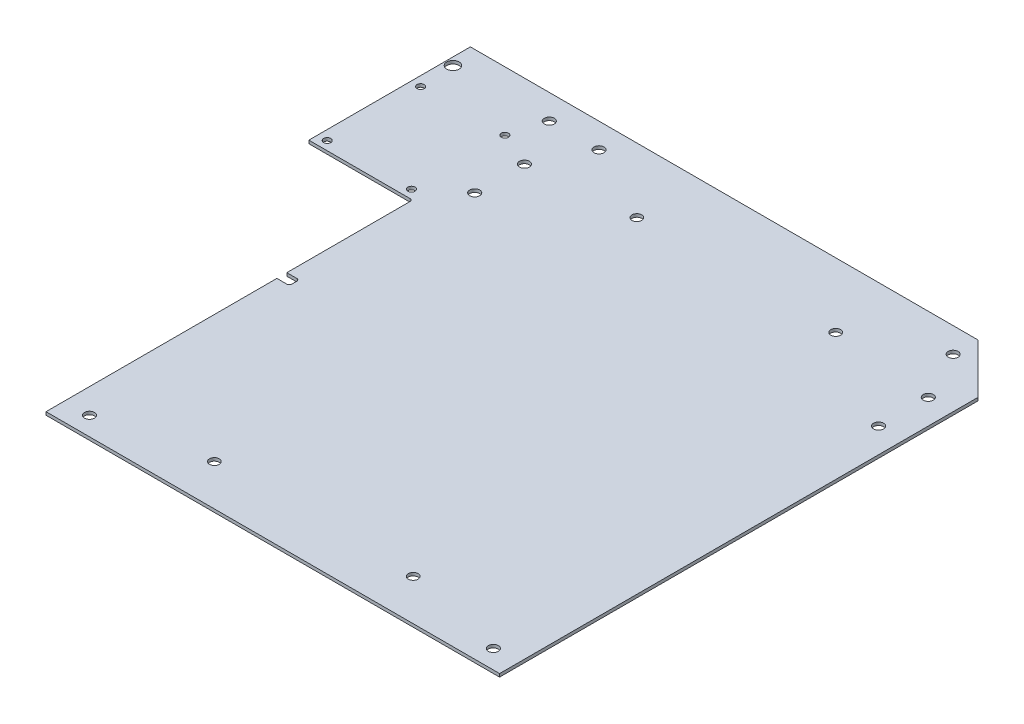
ISO-10303-21;
HEADER;
FILE_DESCRIPTION(('STEP AP214'),'2;1');
FILE_NAME('part.step','',(''),(''),'','','');
FILE_SCHEMA(('AUTOMOTIVE_DESIGN { 1 0 10303 214 1 1 1 1 }'));
ENDSEC;
DATA;
#1=APPLICATION_CONTEXT('core data for automotive mechanical design processes');
#2=APPLICATION_PROTOCOL_DEFINITION('international standard','automotive_design',2000,#1);
#3=PRODUCT_CONTEXT('',#1,'mechanical');
#4=PRODUCT('Part','Part','',(#3));
#5=PRODUCT_RELATED_PRODUCT_CATEGORY('part','',(#4));
#6=PRODUCT_DEFINITION_FORMATION('','',#4);
#7=PRODUCT_DEFINITION_CONTEXT('part definition',#1,'design');
#8=PRODUCT_DEFINITION('design','',#6,#7);
#9=PRODUCT_DEFINITION_SHAPE('','',#8);
#10=(LENGTH_UNIT() NAMED_UNIT(*) SI_UNIT(.MILLI.,.METRE.));
#11=(NAMED_UNIT(*) PLANE_ANGLE_UNIT() SI_UNIT($,.RADIAN.));
#12=(NAMED_UNIT(*) SI_UNIT($,.STERADIAN.) SOLID_ANGLE_UNIT());
#13=UNCERTAINTY_MEASURE_WITH_UNIT(LENGTH_MEASURE(1.E-05),#10,'distance_accuracy_value','');
#14=(GEOMETRIC_REPRESENTATION_CONTEXT(3) GLOBAL_UNCERTAINTY_ASSIGNED_CONTEXT((#13)) GLOBAL_UNIT_ASSIGNED_CONTEXT((#10,
#11,#12)) REPRESENTATION_CONTEXT('',''));
#15=CARTESIAN_POINT('',(0.,0.,0.));
#16=DIRECTION('',(0.,0.,1.));
#17=DIRECTION('',(1.,0.,0.));
#18=AXIS2_PLACEMENT_3D('',#15,#16,#17);
#19=CARTESIAN_POINT('',(-97.4265046484034,0.,-182.433465163806));
#20=DIRECTION('',(0.,-1.,0.));
#21=DIRECTION('',(0.,0.,-1.));
#22=AXIS2_PLACEMENT_3D('',#19,#20,#21);
#23=PLANE('',#22);
#24=CARTESIAN_POINT('',(-31.0690043991156,0.,-233.22189625033));
#25=DIRECTION('',(0.,1.,0.));
#26=DIRECTION('',(0.,0.,1.));
#27=AXIS2_PLACEMENT_3D('',#24,#25,#26);
#28=CIRCLE('',#27,2.48919999999999);
#29=CARTESIAN_POINT('',(-31.0690043991156,0.,-230.73269625033));
#30=VERTEX_POINT('',#29);
#31=EDGE_CURVE('E433',#30,#30,#28,.T.);
#32=ORIENTED_EDGE('',*,*,#31,.T.);
#33=EDGE_LOOP('',(#32));
#34=FACE_BOUND('',#33,.T.);
#35=CARTESIAN_POINT('',(-31.0690043991156,0.,-17.3218962503304));
#36=DIRECTION('',(0.,1.,0.));
#37=DIRECTION('',(0.,0.,1.));
#38=AXIS2_PLACEMENT_3D('',#35,#36,#37);
#39=CIRCLE('',#38,2.48919999999999);
#40=CARTESIAN_POINT('',(-31.0690043991156,0.,-14.8326962503304));
#41=VERTEX_POINT('',#40);
#42=EDGE_CURVE('E394',#41,#41,#39,.T.);
#43=ORIENTED_EDGE('',*,*,#42,.T.);
#44=EDGE_LOOP('',(#43));
#45=FACE_BOUND('',#44,.T.);
#46=DIRECTION('',(-1.,0.,0.));
#47=VECTOR('',#46,1.);
#48=CARTESIAN_POINT('',(-91.0765046484034,0.,-119.441465166843));
#49=LINE('',#48,#47);
#50=CARTESIAN_POINT('',(-91.0765046484034,0.,-119.441465166843));
#51=VERTEX_POINT('',#50);
#52=CARTESIAN_POINT('',(-96.1565046484034,0.,-119.441465166843));
#53=VERTEX_POINT('',#52);
#54=EDGE_CURVE('E355',#51,#53,#49,.T.);
#55=ORIENTED_EDGE('',*,*,#54,.T.);
#56=DIRECTION('',(0.,0.,1.));
#57=VECTOR('',#56,1.);
#58=CARTESIAN_POINT('',(-96.1565046484034,0.,3.62153483315741));
#59=LINE('',#58,#57);
#60=CARTESIAN_POINT('',(-96.1565046484034,0.,-182.433465163806));
#61=VERTEX_POINT('',#60);
#62=EDGE_CURVE('E188',#61,#53,#59,.T.);
#63=ORIENTED_EDGE('',*,*,#62,.F.);
#64=CARTESIAN_POINT('',(-97.4265046484034,0.,-182.433465163806));
#65=DIRECTION('',(0.,-1.,0.));
#66=DIRECTION('',(0.,0.,-1.));
#67=AXIS2_PLACEMENT_3D('',#64,#65,#66);
#68=CIRCLE('',#67,1.26999999999999);
#69=CARTESIAN_POINT('',(-97.4265046484034,0.,-183.703465163806));
#70=VERTEX_POINT('',#69);
#71=EDGE_CURVE('E185',#70,#61,#68,.T.);
#72=ORIENTED_EDGE('',*,*,#71,.F.);
#73=DIRECTION('',(1.,0.,0.));
#74=VECTOR('',#73,1.);
#75=CARTESIAN_POINT('',(-149.179004652955,0.,-183.703465163806));
#76=LINE('',#75,#74);
#77=CARTESIAN_POINT('',(-149.179004652955,0.,-183.703465163806));
#78=VERTEX_POINT('',#77);
#79=EDGE_CURVE('E145',#78,#70,#76,.T.);
#80=ORIENTED_EDGE('',*,*,#79,.F.);
#81=DIRECTION('',(0.,0.,1.));
#82=VECTOR('',#81,1.);
#83=CARTESIAN_POINT('',(-149.179004652955,0.,-266.253465163806));
#84=LINE('',#83,#82);
#85=CARTESIAN_POINT('',(-149.179004652955,0.,-266.253465163806));
#86=VERTEX_POINT('',#85);
#87=EDGE_CURVE('E180',#86,#78,#84,.T.);
#88=ORIENTED_EDGE('',*,*,#87,.F.);
#89=DIRECTION('',(-1.,0.,0.));
#90=VECTOR('',#89,1.);
#91=CARTESIAN_POINT('',(-70.7565046954415,0.,-266.253465163806));
#92=LINE('',#91,#90);
#93=CARTESIAN_POINT('',(110.218495880853,0.,-266.253465163807));
#94=VERTEX_POINT('',#93);
#95=EDGE_CURVE('E177',#94,#86,#92,.T.);
#96=ORIENTED_EDGE('',*,*,#95,.F.);
#97=DIRECTION('',(-0.707106780825484,0.,-0.707106781547611));
#98=VECTOR('',#97,1.);
#99=CARTESIAN_POINT('',(135.618495854913,0.,-240.853465163806));
#100=LINE('',#99,#98);
#101=CARTESIAN_POINT('',(135.618495854913,0.,-240.853465163806));
#102=VERTEX_POINT('',#101);
#103=EDGE_CURVE('E173',#102,#94,#100,.T.);
#104=ORIENTED_EDGE('',*,*,#103,.F.);
#105=DIRECTION('',(0.,0.,-1.));
#106=VECTOR('',#105,1.);
#107=CARTESIAN_POINT('',(135.618495854913,0.,3.62153483315741));
#108=LINE('',#107,#106);
#109=CARTESIAN_POINT('',(135.618495854913,0.,3.62153483315741));
#110=VERTEX_POINT('',#109);
#111=EDGE_CURVE('E169',#110,#102,#108,.T.);
#112=ORIENTED_EDGE('',*,*,#111,.F.);
#113=DIRECTION('',(1.,0.,0.));
#114=VECTOR('',#113,1.);
#115=CARTESIAN_POINT('',(-96.1565046484034,0.,3.62153483315741));
#116=LINE('',#115,#114);
#117=CARTESIAN_POINT('',(-96.1565046484034,0.,3.62153483315741));
#118=VERTEX_POINT('',#117);
#119=EDGE_CURVE('E165',#118,#110,#116,.T.);
#120=ORIENTED_EDGE('',*,*,#119,.F.);
#121=CARTESIAN_POINT('',(-96.1565046484034,0.,-114.361465166843));
#122=VERTEX_POINT('',#121);
#123=EDGE_CURVE('E103',#122,#118,#59,.T.);
#124=ORIENTED_EDGE('',*,*,#123,.F.);
#125=DIRECTION('',(1.,0.,0.));
#126=VECTOR('',#125,1.);
#127=CARTESIAN_POINT('',(-96.1565046484034,0.,-114.361465166843));
#128=LINE('',#127,#126);
#129=CARTESIAN_POINT('',(-91.0765046484034,0.,-114.361465166843));
#130=VERTEX_POINT('',#129);
#131=EDGE_CURVE('E377',#122,#130,#128,.T.);
#132=ORIENTED_EDGE('',*,*,#131,.T.);
#133=CARTESIAN_POINT('',(-91.0765046484034,0.,-115.631465166843));
#134=DIRECTION('',(0.,1.,0.));
#135=DIRECTION('',(0.,0.,1.));
#136=AXIS2_PLACEMENT_3D('',#133,#134,#135);
#137=CIRCLE('',#136,1.26999999999999);
#138=CARTESIAN_POINT('',(-89.8065046484034,0.,-115.631465166843));
#139=VERTEX_POINT('',#138);
#140=EDGE_CURVE('E60',#130,#139,#137,.T.);
#141=ORIENTED_EDGE('',*,*,#140,.T.);
#142=DIRECTION('',(0.,0.,-1.));
#143=VECTOR('',#142,1.);
#144=CARTESIAN_POINT('',(-89.8065046484034,0.,-115.631465166843));
#145=LINE('',#144,#143);
#146=CARTESIAN_POINT('',(-89.8065046484034,0.,-118.171465166843));
#147=VERTEX_POINT('',#146);
#148=EDGE_CURVE('E401',#139,#147,#145,.T.);
#149=ORIENTED_EDGE('',*,*,#148,.T.);
#150=CARTESIAN_POINT('',(-91.0765046484034,0.,-118.171465166843));
#151=DIRECTION('',(0.,1.,0.));
#152=DIRECTION('',(0.,0.,1.));
#153=AXIS2_PLACEMENT_3D('',#150,#151,#152);
#154=CIRCLE('',#153,1.26999999999999);
#155=EDGE_CURVE('E397',#147,#51,#154,.T.);
#156=ORIENTED_EDGE('',*,*,#155,.T.);
#157=EDGE_LOOP('',(#55,#63,#72,#80,#88,#96,#104,#112,#120,#124,#132,#141,#149,#156));
#158=FACE_BOUND('',#157,.T.);
#159=CARTESIAN_POINT('',(-144.30515752718,0.,-235.976041670875));
#160=DIRECTION('',(0.,1.,0.));
#161=DIRECTION('',(0.,0.,1.));
#162=AXIS2_PLACEMENT_3D('',#159,#160,#161);
#163=CIRCLE('',#162,1.82879999999999);
#164=CARTESIAN_POINT('',(-144.30515752718,0.,-234.147241670875));
#165=VERTEX_POINT('',#164);
#166=EDGE_CURVE('E341',#165,#165,#163,.T.);
#167=ORIENTED_EDGE('',*,*,#166,.T.);
#168=EDGE_LOOP('',(#167));
#169=FACE_BOUND('',#168,.T.);
#170=CARTESIAN_POINT('',(-144.30515752718,0.,-188.226395138011));
#171=DIRECTION('',(0.,1.,0.));
#172=DIRECTION('',(0.,0.,1.));
#173=AXIS2_PLACEMENT_3D('',#170,#171,#172);
#174=CIRCLE('',#173,1.82879999999999);
#175=CARTESIAN_POINT('',(-144.30515752718,0.,-186.397595138011));
#176=VERTEX_POINT('',#175);
#177=EDGE_CURVE('E333',#176,#176,#174,.T.);
#178=ORIENTED_EDGE('',*,*,#177,.T.);
#179=EDGE_LOOP('',(#178));
#180=FACE_BOUND('',#179,.T.);
#181=CARTESIAN_POINT('',(-101.258714707612,0.,-188.226395138011));
#182=DIRECTION('',(0.,1.,0.));
#183=DIRECTION('',(0.,0.,1.));
#184=AXIS2_PLACEMENT_3D('',#181,#182,#183);
#185=CIRCLE('',#184,1.82880000000001);
#186=CARTESIAN_POINT('',(-101.258714707612,0.,-186.397595138011));
#187=VERTEX_POINT('',#186);
#188=EDGE_CURVE('E325',#187,#187,#185,.T.);
#189=ORIENTED_EDGE('',*,*,#188,.T.);
#190=EDGE_LOOP('',(#189));
#191=FACE_BOUND('',#190,.T.);
#192=CARTESIAN_POINT('',(-101.258714707612,0.,-235.978395138011));
#193=DIRECTION('',(0.,1.,0.));
#194=DIRECTION('',(0.,0.,1.));
#195=AXIS2_PLACEMENT_3D('',#192,#193,#194);
#196=CIRCLE('',#195,1.82880000000001);
#197=CARTESIAN_POINT('',(-101.258714707612,0.,-234.149595138011));
#198=VERTEX_POINT('',#197);
#199=EDGE_CURVE('E317',#198,#198,#196,.T.);
#200=ORIENTED_EDGE('',*,*,#199,.T.);
#201=EDGE_LOOP('',(#200));
#202=FACE_BOUND('',#201,.T.);
#203=CARTESIAN_POINT('',(-145.369004652955,0.,-253.553465163806));
#204=DIRECTION('',(0.,-1.,0.));
#205=DIRECTION('',(0.,0.,-1.));
#206=AXIS2_PLACEMENT_3D('',#203,#204,#205);
#207=CIRCLE('',#206,3.17500000000001);
#208=CARTESIAN_POINT('',(-145.369004652955,0.,-256.728465163806));
#209=VERTEX_POINT('',#208);
#210=EDGE_CURVE('E313',#209,#209,#207,.T.);
#211=ORIENTED_EDGE('',*,*,#210,.F.);
#212=EDGE_LOOP('',(#211));
#213=FACE_BOUND('',#212,.T.);
#214=CARTESIAN_POINT('',(-83.4565046529283,0.,-202.753466179806));
#215=DIRECTION('',(0.,1.,0.));
#216=DIRECTION('',(0.,0.,1.));
#217=AXIS2_PLACEMENT_3D('',#214,#215,#216);
#218=CIRCLE('',#217,2.55269999999999);
#219=CARTESIAN_POINT('',(-83.4565046529283,0.,-200.200766179806));
#220=VERTEX_POINT('',#219);
#221=EDGE_CURVE('E301',#220,#220,#218,.T.);
#222=ORIENTED_EDGE('',*,*,#221,.T.);
#223=EDGE_LOOP('',(#222));
#224=FACE_BOUND('',#223,.T.);
#225=CARTESIAN_POINT('',(-83.4565046529283,0.,-228.153466179806));
#226=DIRECTION('',(0.,1.,0.));
#227=DIRECTION('',(0.,0.,1.));
#228=AXIS2_PLACEMENT_3D('',#225,#226,#227);
#229=CIRCLE('',#228,2.55269999999999);
#230=CARTESIAN_POINT('',(-83.4565046529283,0.,-225.600766179806));
#231=VERTEX_POINT('',#230);
#232=EDGE_CURVE('E293',#231,#231,#229,.T.);
#233=ORIENTED_EDGE('',*,*,#232,.T.);
#234=EDGE_LOOP('',(#233));
#235=FACE_BOUND('',#234,.T.);
#236=CARTESIAN_POINT('',(-70.7565046529283,0.,-253.553466179806));
#237=DIRECTION('',(0.,1.,0.));
#238=DIRECTION('',(0.,0.,1.));
#239=AXIS2_PLACEMENT_3D('',#236,#237,#238);
#240=CIRCLE('',#239,2.55269999999999);
#241=CARTESIAN_POINT('',(-70.7565046529283,0.,-251.000766179806));
#242=VERTEX_POINT('',#241);
#243=EDGE_CURVE('E285',#242,#242,#240,.T.);
#244=ORIENTED_EDGE('',*,*,#243,.T.);
#245=EDGE_LOOP('',(#244));
#246=FACE_BOUND('',#245,.T.);
#247=CARTESIAN_POINT('',(122.918495854842,0.,-202.75346516381));
#248=DIRECTION('',(0.,1.,0.));
#249=DIRECTION('',(0.,0.,1.));
#250=AXIS2_PLACEMENT_3D('',#247,#248,#249);
#251=CIRCLE('',#250,2.55269999999999);
#252=CARTESIAN_POINT('',(122.918495854842,0.,-200.20076516381));
#253=VERTEX_POINT('',#252);
#254=EDGE_CURVE('E277',#253,#253,#251,.T.);
#255=ORIENTED_EDGE('',*,*,#254,.T.);
#256=EDGE_LOOP('',(#255));
#257=FACE_BOUND('',#256,.T.);
#258=CARTESIAN_POINT('',(122.918495854842,0.,-228.15346516381));
#259=DIRECTION('',(0.,1.,0.));
#260=DIRECTION('',(0.,0.,1.));
#261=AXIS2_PLACEMENT_3D('',#258,#259,#260);
#262=CIRCLE('',#261,2.55269999999999);
#263=CARTESIAN_POINT('',(122.918495854842,0.,-225.60076516381));
#264=VERTEX_POINT('',#263);
#265=EDGE_CURVE('E269',#264,#264,#262,.T.);
#266=ORIENTED_EDGE('',*,*,#265,.T.);
#267=EDGE_LOOP('',(#266));
#268=FACE_BOUND('',#267,.T.);
#269=CARTESIAN_POINT('',(110.218495854842,0.,-253.553465163811));
#270=DIRECTION('',(0.,1.,0.));
#271=DIRECTION('',(0.,0.,1.));
#272=AXIS2_PLACEMENT_3D('',#269,#270,#271);
#273=CIRCLE('',#272,2.55269999999999);
#274=CARTESIAN_POINT('',(110.218495854842,0.,-251.000765163811));
#275=VERTEX_POINT('',#274);
#276=EDGE_CURVE('E261',#275,#275,#273,.T.);
#277=ORIENTED_EDGE('',*,*,#276,.T.);
#278=EDGE_LOOP('',(#277));
#279=FACE_BOUND('',#278,.T.);
#280=CARTESIAN_POINT('',(-83.4565046529281,0.,-5.9034656718055));
#281=DIRECTION('',(0.,1.,0.));
#282=DIRECTION('',(0.,0.,1.));
#283=AXIS2_PLACEMENT_3D('',#280,#281,#282);
#284=CIRCLE('',#283,2.55269999999999);
#285=CARTESIAN_POINT('',(-83.4565046529281,0.,-3.35076567180551));
#286=VERTEX_POINT('',#285);
#287=EDGE_CURVE('E253',#286,#286,#284,.T.);
#288=ORIENTED_EDGE('',*,*,#287,.T.);
#289=EDGE_LOOP('',(#288));
#290=FACE_BOUND('',#289,.T.);
#291=CARTESIAN_POINT('',(122.918495854914,0.,-5.90346567180618));
#292=DIRECTION('',(0.,1.,0.));
#293=DIRECTION('',(0.,0.,1.));
#294=AXIS2_PLACEMENT_3D('',#291,#292,#293);
#295=CIRCLE('',#294,2.55270000000001);
#296=CARTESIAN_POINT('',(122.918495854914,0.,-3.35076567180617));
#297=VERTEX_POINT('',#296);
#298=EDGE_CURVE('E245',#297,#297,#295,.T.);
#299=ORIENTED_EDGE('',*,*,#298,.T.);
#300=EDGE_LOOP('',(#299));
#301=FACE_BOUND('',#300,.T.);
#302=CARTESIAN_POINT('',(-96.1565047197605,0.,-253.553466178288));
#303=DIRECTION('',(0.,1.,0.));
#304=DIRECTION('',(0.,0.,1.));
#305=AXIS2_PLACEMENT_3D('',#302,#303,#304);
#306=CIRCLE('',#305,2.55269999999999);
#307=CARTESIAN_POINT('',(-96.1565047197605,0.,-251.000766178288));
#308=VERTEX_POINT('',#307);
#309=EDGE_CURVE('E170',#308,#308,#306,.T.);
#310=ORIENTED_EDGE('',*,*,#309,.T.);
#311=EDGE_LOOP('',(#310));
#312=FACE_BOUND('',#311,.T.);
#313=CARTESIAN_POINT('',(70.5309956008844,0.,-17.3218962503304));
#314=DIRECTION('',(0.,1.,0.));
#315=DIRECTION('',(0.,0.,1.));
#316=AXIS2_PLACEMENT_3D('',#313,#314,#315);
#317=CIRCLE('',#316,2.4892);
#318=CARTESIAN_POINT('',(70.5309956008844,0.,-14.8326962503304));
#319=VERTEX_POINT('',#318);
#320=EDGE_CURVE('E417',#319,#319,#317,.T.);
#321=ORIENTED_EDGE('',*,*,#320,.T.);
#322=EDGE_LOOP('',(#321));
#323=FACE_BOUND('',#322,.T.);
#324=CARTESIAN_POINT('',(70.5309956008844,0.,-233.22189625033));
#325=DIRECTION('',(0.,1.,0.));
#326=DIRECTION('',(0.,0.,1.));
#327=AXIS2_PLACEMENT_3D('',#324,#325,#326);
#328=CIRCLE('',#327,2.4892);
#329=CARTESIAN_POINT('',(70.5309956008844,0.,-230.73269625033));
#330=VERTEX_POINT('',#329);
#331=EDGE_CURVE('E425',#330,#330,#328,.T.);
#332=ORIENTED_EDGE('',*,*,#331,.T.);
#333=EDGE_LOOP('',(#332));
#334=FACE_BOUND('',#333,.T.);
#335=ADVANCED_FACE('F44',(#34,#45,#158,#169,#180,#191,#202,#213,#224,#235,#246,#257,#268,#279,
#290,#301,#312,#323,#334),#23,.T.);
#336=CARTESIAN_POINT('',(-96.1565046484034,1.5875,3.62153483315741));
#337=DIRECTION('',(1.,0.,0.));
#338=DIRECTION('',(0.,0.,-1.));
#339=AXIS2_PLACEMENT_3D('',#336,#337,#338);
#340=PLANE('',#339);
#341=ORIENTED_EDGE('',*,*,#62,.T.);
#342=DIRECTION('',(0.,1.,0.));
#343=VECTOR('',#342,1.);
#344=CARTESIAN_POINT('',(-96.1565046484034,0.,-119.441465166843));
#345=LINE('',#344,#343);
#346=CARTESIAN_POINT('',(-96.1565046484034,1.5875,-119.441465166843));
#347=VERTEX_POINT('',#346);
#348=EDGE_CURVE('E349',#53,#347,#345,.T.);
#349=ORIENTED_EDGE('',*,*,#348,.T.);
#350=DIRECTION('',(0.,0.,1.));
#351=VECTOR('',#350,1.);
#352=CARTESIAN_POINT('',(-96.1565046484034,1.5875,3.62153483315741));
#353=LINE('',#352,#351);
#354=CARTESIAN_POINT('',(-96.1565046484034,1.5875,-182.433465163806));
#355=VERTEX_POINT('',#354);
#356=EDGE_CURVE('E159',#355,#347,#353,.T.);
#357=ORIENTED_EDGE('',*,*,#356,.F.);
#358=DIRECTION('',(0.,-1.,0.));
#359=VECTOR('',#358,1.);
#360=CARTESIAN_POINT('',(-96.1565046484034,1.5875,-182.433465163806));
#361=LINE('',#360,#359);
#362=EDGE_CURVE('E150',#355,#61,#361,.T.);
#363=ORIENTED_EDGE('',*,*,#362,.T.);
#364=EDGE_LOOP('',(#341,#349,#357,#363));
#365=FACE_BOUND('',#364,.T.);
#366=ADVANCED_FACE('F496',(#365),#340,.F.);
#367=CARTESIAN_POINT('',(-96.1565046484034,1.5875,3.62153483315741));
#368=DIRECTION('',(0.,0.,-1.));
#369=DIRECTION('',(-1.,0.,0.));
#370=AXIS2_PLACEMENT_3D('',#367,#368,#369);
#371=PLANE('',#370);
#372=ORIENTED_EDGE('',*,*,#119,.T.);
#373=DIRECTION('',(0.,-1.,0.));
#374=VECTOR('',#373,1.);
#375=CARTESIAN_POINT('',(135.618495854913,1.5875,3.62153483315741));
#376=LINE('',#375,#374);
#377=CARTESIAN_POINT('',(135.618495854913,1.5875,3.62153483315741));
#378=VERTEX_POINT('',#377);
#379=EDGE_CURVE('E11',#378,#110,#376,.T.);
#380=ORIENTED_EDGE('',*,*,#379,.F.);
#381=DIRECTION('',(1.,0.,0.));
#382=VECTOR('',#381,1.);
#383=CARTESIAN_POINT('',(-96.1565046484034,1.5875,3.62153483315741));
#384=LINE('',#383,#382);
#385=CARTESIAN_POINT('',(-96.1565046484034,1.5875,3.62153483315741));
#386=VERTEX_POINT('',#385);
#387=EDGE_CURVE('E192',#386,#378,#384,.T.);
#388=ORIENTED_EDGE('',*,*,#387,.F.);
#389=DIRECTION('',(0.,-1.,0.));
#390=VECTOR('',#389,1.);
#391=CARTESIAN_POINT('',(-96.1565046484034,1.5875,3.62153483315741));
#392=LINE('',#391,#390);
#393=EDGE_CURVE('E164',#386,#118,#392,.T.);
#394=ORIENTED_EDGE('',*,*,#393,.T.);
#395=EDGE_LOOP('',(#372,#380,#388,#394));
#396=FACE_BOUND('',#395,.T.);
#397=ADVANCED_FACE('F46',(#396),#371,.F.);
#398=CARTESIAN_POINT('',(135.618495854913,1.5875,3.62153483315741));
#399=DIRECTION('',(-1.,0.,0.));
#400=DIRECTION('',(0.,0.,1.));
#401=AXIS2_PLACEMENT_3D('',#398,#399,#400);
#402=PLANE('',#401);
#403=ORIENTED_EDGE('',*,*,#111,.T.);
#404=DIRECTION('',(0.,-1.,0.));
#405=VECTOR('',#404,1.);
#406=CARTESIAN_POINT('',(135.618495854913,1.5875,-240.853465163806));
#407=LINE('',#406,#405);
#408=CARTESIAN_POINT('',(135.618495854913,1.5875,-240.853465163806));
#409=VERTEX_POINT('',#408);
#410=EDGE_CURVE('E53',#409,#102,#407,.T.);
#411=ORIENTED_EDGE('',*,*,#410,.F.);
#412=DIRECTION('',(0.,0.,-1.));
#413=VECTOR('',#412,1.);
#414=CARTESIAN_POINT('',(135.618495854913,1.5875,3.62153483315741));
#415=LINE('',#414,#413);
#416=EDGE_CURVE('E111',#378,#409,#415,.T.);
#417=ORIENTED_EDGE('',*,*,#416,.F.);
#418=ORIENTED_EDGE('',*,*,#379,.T.);
#419=EDGE_LOOP('',(#403,#411,#417,#418));
#420=FACE_BOUND('',#419,.T.);
#421=ADVANCED_FACE('F517',(#420),#402,.F.);
#422=CARTESIAN_POINT('',(135.618495854913,1.5875,-240.853465163806));
#423=DIRECTION('',(-0.707106781547611,0.,0.707106780825484));
#424=DIRECTION('',(0.707106780825484,0.,0.707106781547611));
#425=AXIS2_PLACEMENT_3D('',#422,#423,#424);
#426=PLANE('',#425);
#427=ORIENTED_EDGE('',*,*,#103,.T.);
#428=DIRECTION('',(0.,-1.,0.));
#429=VECTOR('',#428,1.);
#430=CARTESIAN_POINT('',(110.218495880853,1.5875,-266.253465163807));
#431=LINE('',#430,#429);
#432=CARTESIAN_POINT('',(110.218495880853,1.5875,-266.253465163807));
#433=VERTEX_POINT('',#432);
#434=EDGE_CURVE('E203',#433,#94,#431,.T.);
#435=ORIENTED_EDGE('',*,*,#434,.F.);
#436=DIRECTION('',(-0.707106780825484,0.,-0.707106781547611));
#437=VECTOR('',#436,1.);
#438=CARTESIAN_POINT('',(135.618495854913,1.5875,-240.853465163806));
#439=LINE('',#438,#437);
#440=EDGE_CURVE('E214',#409,#433,#439,.T.);
#441=ORIENTED_EDGE('',*,*,#440,.F.);
#442=ORIENTED_EDGE('',*,*,#410,.T.);
#443=EDGE_LOOP('',(#427,#435,#441,#442));
#444=FACE_BOUND('',#443,.T.);
#445=ADVANCED_FACE('F212',(#444),#426,.F.);
#446=CARTESIAN_POINT('',(-70.7565046954415,1.5875,-266.253465163806));
#447=DIRECTION('',(0.,0.,1.));
#448=DIRECTION('',(1.,0.,0.));
#449=AXIS2_PLACEMENT_3D('',#446,#447,#448);
#450=PLANE('',#449);
#451=ORIENTED_EDGE('',*,*,#95,.T.);
#452=DIRECTION('',(0.,-1.,0.));
#453=VECTOR('',#452,1.);
#454=CARTESIAN_POINT('',(-149.179004652955,1.5875,-266.253465163806));
#455=LINE('',#454,#453);
#456=CARTESIAN_POINT('',(-149.179004652955,1.5875,-266.253465163806));
#457=VERTEX_POINT('',#456);
#458=EDGE_CURVE('E199',#457,#86,#455,.T.);
#459=ORIENTED_EDGE('',*,*,#458,.F.);
#460=DIRECTION('',(-1.,0.,0.));
#461=VECTOR('',#460,1.);
#462=CARTESIAN_POINT('',(110.218495880853,1.5875,-266.253465163807));
#463=LINE('',#462,#461);
#464=EDGE_CURVE('E227',#433,#457,#463,.T.);
#465=ORIENTED_EDGE('',*,*,#464,.F.);
#466=ORIENTED_EDGE('',*,*,#434,.T.);
#467=EDGE_LOOP('',(#451,#459,#465,#466));
#468=FACE_BOUND('',#467,.T.);
#469=ADVANCED_FACE('F222',(#468),#450,.F.);
#470=CARTESIAN_POINT('',(-149.179004652955,1.5875,-266.253465163806));
#471=DIRECTION('',(1.,0.,0.));
#472=DIRECTION('',(0.,0.,-1.));
#473=AXIS2_PLACEMENT_3D('',#470,#471,#472);
#474=PLANE('',#473);
#475=ORIENTED_EDGE('',*,*,#87,.T.);
#476=DIRECTION('',(0.,-1.,0.));
#477=VECTOR('',#476,1.);
#478=CARTESIAN_POINT('',(-149.179004652955,1.5875,-183.703465163806));
#479=LINE('',#478,#477);
#480=CARTESIAN_POINT('',(-149.179004652955,1.5875,-183.703465163806));
#481=VERTEX_POINT('',#480);
#482=EDGE_CURVE('E149',#481,#78,#479,.T.);
#483=ORIENTED_EDGE('',*,*,#482,.F.);
#484=DIRECTION('',(0.,0.,1.));
#485=VECTOR('',#484,1.);
#486=CARTESIAN_POINT('',(-149.179004652955,1.5875,-266.253465163806));
#487=LINE('',#486,#485);
#488=EDGE_CURVE('E135',#457,#481,#487,.T.);
#489=ORIENTED_EDGE('',*,*,#488,.F.);
#490=ORIENTED_EDGE('',*,*,#458,.T.);
#491=EDGE_LOOP('',(#475,#483,#489,#490));
#492=FACE_BOUND('',#491,.T.);
#493=ADVANCED_FACE('F225',(#492),#474,.F.);
#494=CARTESIAN_POINT('',(-149.179004652955,1.5875,-183.703465163806));
#495=DIRECTION('',(0.,0.,-1.));
#496=DIRECTION('',(-1.,0.,0.));
#497=AXIS2_PLACEMENT_3D('',#494,#495,#496);
#498=PLANE('',#497);
#499=ORIENTED_EDGE('',*,*,#79,.T.);
#500=DIRECTION('',(0.,-1.,0.));
#501=VECTOR('',#500,1.);
#502=CARTESIAN_POINT('',(-97.4265046484034,1.5875,-183.703465163806));
#503=LINE('',#502,#501);
#504=CARTESIAN_POINT('',(-97.4265046484034,1.5875,-183.703465163806));
#505=VERTEX_POINT('',#504);
#506=EDGE_CURVE('E142',#505,#70,#503,.T.);
#507=ORIENTED_EDGE('',*,*,#506,.F.);
#508=DIRECTION('',(1.,0.,0.));
#509=VECTOR('',#508,1.);
#510=CARTESIAN_POINT('',(-149.179004652955,1.5875,-183.703465163806));
#511=LINE('',#510,#509);
#512=EDGE_CURVE('E127',#481,#505,#511,.T.);
#513=ORIENTED_EDGE('',*,*,#512,.F.);
#514=ORIENTED_EDGE('',*,*,#482,.T.);
#515=EDGE_LOOP('',(#499,#507,#513,#514));
#516=FACE_BOUND('',#515,.T.);
#517=ADVANCED_FACE('F143',(#516),#498,.F.);
#518=CARTESIAN_POINT('',(-97.4265046484034,1.5875,-182.433465163806));
#519=DIRECTION('',(0.,-1.,0.));
#520=DIRECTION('',(0.,0.,-1.));
#521=AXIS2_PLACEMENT_3D('',#518,#519,#520);
#522=CYLINDRICAL_SURFACE('',#521,1.26999999999999);
#523=ORIENTED_EDGE('',*,*,#71,.T.);
#524=ORIENTED_EDGE('',*,*,#362,.F.);
#525=CARTESIAN_POINT('',(-97.4265046484034,1.5875,-182.433465163806));
#526=DIRECTION('',(0.,-1.,0.));
#527=DIRECTION('',(0.,0.,-1.));
#528=AXIS2_PLACEMENT_3D('',#525,#526,#527);
#529=CIRCLE('',#528,1.26999999999999);
#530=EDGE_CURVE('E132',#505,#355,#529,.T.);
#531=ORIENTED_EDGE('',*,*,#530,.F.);
#532=ORIENTED_EDGE('',*,*,#506,.T.);
#533=EDGE_LOOP('',(#523,#524,#531,#532));
#534=FACE_BOUND('',#533,.T.);
#535=ADVANCED_FACE('F152',(#534),#522,.F.);
#536=CARTESIAN_POINT('',(-96.1565046484034,1.5875,-114.361465166843));
#537=VERTEX_POINT('',#536);
#538=EDGE_CURVE('E69',#537,#386,#353,.T.);
#539=ORIENTED_EDGE('',*,*,#538,.F.);
#540=DIRECTION('',(0.,1.,0.));
#541=VECTOR('',#540,1.);
#542=CARTESIAN_POINT('',(-96.1565046484034,0.,-114.361465166843));
#543=LINE('',#542,#541);
#544=EDGE_CURVE('E350',#122,#537,#543,.T.);
#545=ORIENTED_EDGE('',*,*,#544,.F.);
#546=ORIENTED_EDGE('',*,*,#123,.T.);
#547=ORIENTED_EDGE('',*,*,#393,.F.);
#548=EDGE_LOOP('',(#539,#545,#546,#547));
#549=FACE_BOUND('',#548,.T.);
#550=ADVANCED_FACE('F447',(#549),#340,.F.);
#551=CARTESIAN_POINT('',(-97.4265046484034,1.5875,-182.433465163806));
#552=DIRECTION('',(0.,-1.,0.));
#553=DIRECTION('',(0.,0.,-1.));
#554=AXIS2_PLACEMENT_3D('',#551,#552,#553);
#555=PLANE('',#554);
#556=CARTESIAN_POINT('',(-31.0690043991156,1.5875,-233.22189625033));
#557=DIRECTION('',(0.,1.,0.));
#558=DIRECTION('',(0.,0.,1.));
#559=AXIS2_PLACEMENT_3D('',#556,#557,#558);
#560=CIRCLE('',#559,2.48919999999999);
#561=CARTESIAN_POINT('',(-31.0690043991156,1.5875,-230.73269625033));
#562=VERTEX_POINT('',#561);
#563=EDGE_CURVE('E437',#562,#562,#560,.T.);
#564=ORIENTED_EDGE('',*,*,#563,.F.);
#565=EDGE_LOOP('',(#564));
#566=FACE_BOUND('',#565,.T.);
#567=CARTESIAN_POINT('',(70.5309956008844,1.5875,-233.22189625033));
#568=DIRECTION('',(0.,1.,0.));
#569=DIRECTION('',(0.,0.,1.));
#570=AXIS2_PLACEMENT_3D('',#567,#568,#569);
#571=CIRCLE('',#570,2.48919999999998);
#572=CARTESIAN_POINT('',(70.5309956008844,1.5875,-230.73269625033));
#573=VERTEX_POINT('',#572);
#574=EDGE_CURVE('E429',#573,#573,#571,.T.);
#575=ORIENTED_EDGE('',*,*,#574,.F.);
#576=EDGE_LOOP('',(#575));
#577=FACE_BOUND('',#576,.T.);
#578=CARTESIAN_POINT('',(70.5309956008844,1.5875,-17.3218962503304));
#579=DIRECTION('',(0.,1.,0.));
#580=DIRECTION('',(0.,0.,1.));
#581=AXIS2_PLACEMENT_3D('',#578,#579,#580);
#582=CIRCLE('',#581,2.48919999999998);
#583=CARTESIAN_POINT('',(70.5309956008844,1.5875,-14.8326962503304));
#584=VERTEX_POINT('',#583);
#585=EDGE_CURVE('E421',#584,#584,#582,.T.);
#586=ORIENTED_EDGE('',*,*,#585,.F.);
#587=EDGE_LOOP('',(#586));
#588=FACE_BOUND('',#587,.T.);
#589=CARTESIAN_POINT('',(-31.0690043991156,1.5875,-17.3218962503304));
#590=DIRECTION('',(0.,1.,0.));
#591=DIRECTION('',(0.,0.,1.));
#592=AXIS2_PLACEMENT_3D('',#589,#590,#591);
#593=CIRCLE('',#592,2.48919999999999);
#594=CARTESIAN_POINT('',(-31.0690043991156,1.5875,-14.8326962503304));
#595=VERTEX_POINT('',#594);
#596=EDGE_CURVE('E413',#595,#595,#593,.T.);
#597=ORIENTED_EDGE('',*,*,#596,.F.);
#598=EDGE_LOOP('',(#597));
#599=FACE_BOUND('',#598,.T.);
#600=CARTESIAN_POINT('',(-144.30515752718,1.5875,-235.976041670875));
#601=DIRECTION('',(0.,1.,0.));
#602=DIRECTION('',(0.,0.,1.));
#603=AXIS2_PLACEMENT_3D('',#600,#601,#602);
#604=CIRCLE('',#603,1.82879999999999);
#605=CARTESIAN_POINT('',(-144.30515752718,1.5875,-234.147241670875));
#606=VERTEX_POINT('',#605);
#607=EDGE_CURVE('E345',#606,#606,#604,.T.);
#608=ORIENTED_EDGE('',*,*,#607,.F.);
#609=EDGE_LOOP('',(#608));
#610=FACE_BOUND('',#609,.T.);
#611=CARTESIAN_POINT('',(-144.30515752718,1.5875,-188.226395138011));
#612=DIRECTION('',(0.,1.,0.));
#613=DIRECTION('',(0.,0.,1.));
#614=AXIS2_PLACEMENT_3D('',#611,#612,#613);
#615=CIRCLE('',#614,1.82879999999999);
#616=CARTESIAN_POINT('',(-144.30515752718,1.5875,-186.397595138011));
#617=VERTEX_POINT('',#616);
#618=EDGE_CURVE('E337',#617,#617,#615,.T.);
#619=ORIENTED_EDGE('',*,*,#618,.F.);
#620=EDGE_LOOP('',(#619));
#621=FACE_BOUND('',#620,.T.);
#622=CARTESIAN_POINT('',(-101.258714707612,1.5875,-188.226395138011));
#623=DIRECTION('',(0.,1.,0.));
#624=DIRECTION('',(0.,0.,1.));
#625=AXIS2_PLACEMENT_3D('',#622,#623,#624);
#626=CIRCLE('',#625,1.82880000000001);
#627=CARTESIAN_POINT('',(-101.258714707612,1.5875,-186.397595138011));
#628=VERTEX_POINT('',#627);
#629=EDGE_CURVE('E329',#628,#628,#626,.T.);
#630=ORIENTED_EDGE('',*,*,#629,.F.);
#631=EDGE_LOOP('',(#630));
#632=FACE_BOUND('',#631,.T.);
#633=CARTESIAN_POINT('',(-101.258714707612,1.5875,-235.978395138011));
#634=DIRECTION('',(0.,1.,0.));
#635=DIRECTION('',(0.,0.,1.));
#636=AXIS2_PLACEMENT_3D('',#633,#634,#635);
#637=CIRCLE('',#636,1.82880000000001);
#638=CARTESIAN_POINT('',(-101.258714707612,1.5875,-234.149595138011));
#639=VERTEX_POINT('',#638);
#640=EDGE_CURVE('E321',#639,#639,#637,.T.);
#641=ORIENTED_EDGE('',*,*,#640,.F.);
#642=EDGE_LOOP('',(#641));
#643=FACE_BOUND('',#642,.T.);
#644=CARTESIAN_POINT('',(-145.369004652955,1.5875,-253.553465163806));
#645=DIRECTION('',(0.,-1.,0.));
#646=DIRECTION('',(0.,0.,-1.));
#647=AXIS2_PLACEMENT_3D('',#644,#645,#646);
#648=CIRCLE('',#647,3.17500000000001);
#649=CARTESIAN_POINT('',(-145.369004652955,1.5875,-256.728465163806));
#650=VERTEX_POINT('',#649);
#651=EDGE_CURVE('E309',#650,#650,#648,.T.);
#652=ORIENTED_EDGE('',*,*,#651,.T.);
#653=EDGE_LOOP('',(#652));
#654=FACE_BOUND('',#653,.T.);
#655=CARTESIAN_POINT('',(-83.4565046529283,1.5875,-202.753466179806));
#656=DIRECTION('',(0.,1.,0.));
#657=DIRECTION('',(0.,0.,1.));
#658=AXIS2_PLACEMENT_3D('',#655,#656,#657);
#659=CIRCLE('',#658,2.55269999999999);
#660=CARTESIAN_POINT('',(-83.4565046529283,1.5875,-200.200766179806));
#661=VERTEX_POINT('',#660);
#662=EDGE_CURVE('E305',#661,#661,#659,.T.);
#663=ORIENTED_EDGE('',*,*,#662,.F.);
#664=EDGE_LOOP('',(#663));
#665=FACE_BOUND('',#664,.T.);
#666=CARTESIAN_POINT('',(-83.4565046529283,1.5875,-228.153466179806));
#667=DIRECTION('',(0.,1.,0.));
#668=DIRECTION('',(0.,0.,1.));
#669=AXIS2_PLACEMENT_3D('',#666,#667,#668);
#670=CIRCLE('',#669,2.55269999999999);
#671=CARTESIAN_POINT('',(-83.4565046529283,1.5875,-225.600766179806));
#672=VERTEX_POINT('',#671);
#673=EDGE_CURVE('E297',#672,#672,#670,.T.);
#674=ORIENTED_EDGE('',*,*,#673,.F.);
#675=EDGE_LOOP('',(#674));
#676=FACE_BOUND('',#675,.T.);
#677=CARTESIAN_POINT('',(-70.7565046529283,1.5875,-253.553466179806));
#678=DIRECTION('',(0.,1.,0.));
#679=DIRECTION('',(0.,0.,1.));
#680=AXIS2_PLACEMENT_3D('',#677,#678,#679);
#681=CIRCLE('',#680,2.55269999999999);
#682=CARTESIAN_POINT('',(-70.7565046529283,1.5875,-251.000766179806));
#683=VERTEX_POINT('',#682);
#684=EDGE_CURVE('E289',#683,#683,#681,.T.);
#685=ORIENTED_EDGE('',*,*,#684,.F.);
#686=EDGE_LOOP('',(#685));
#687=FACE_BOUND('',#686,.T.);
#688=CARTESIAN_POINT('',(122.918495854842,1.5875,-202.75346516381));
#689=DIRECTION('',(0.,1.,0.));
#690=DIRECTION('',(0.,0.,1.));
#691=AXIS2_PLACEMENT_3D('',#688,#689,#690);
#692=CIRCLE('',#691,2.55269999999999);
#693=CARTESIAN_POINT('',(122.918495854842,1.5875,-200.20076516381));
#694=VERTEX_POINT('',#693);
#695=EDGE_CURVE('E281',#694,#694,#692,.T.);
#696=ORIENTED_EDGE('',*,*,#695,.F.);
#697=EDGE_LOOP('',(#696));
#698=FACE_BOUND('',#697,.T.);
#699=CARTESIAN_POINT('',(122.918495854842,1.5875,-228.15346516381));
#700=DIRECTION('',(0.,1.,0.));
#701=DIRECTION('',(0.,0.,1.));
#702=AXIS2_PLACEMENT_3D('',#699,#700,#701);
#703=CIRCLE('',#702,2.55269999999999);
#704=CARTESIAN_POINT('',(122.918495854842,1.5875,-225.60076516381));
#705=VERTEX_POINT('',#704);
#706=EDGE_CURVE('E273',#705,#705,#703,.T.);
#707=ORIENTED_EDGE('',*,*,#706,.F.);
#708=EDGE_LOOP('',(#707));
#709=FACE_BOUND('',#708,.T.);
#710=CARTESIAN_POINT('',(110.218495854842,1.5875,-253.553465163811));
#711=DIRECTION('',(0.,1.,0.));
#712=DIRECTION('',(0.,0.,1.));
#713=AXIS2_PLACEMENT_3D('',#710,#711,#712);
#714=CIRCLE('',#713,2.55269999999999);
#715=CARTESIAN_POINT('',(110.218495854842,1.5875,-251.000765163811));
#716=VERTEX_POINT('',#715);
#717=EDGE_CURVE('E265',#716,#716,#714,.T.);
#718=ORIENTED_EDGE('',*,*,#717,.F.);
#719=EDGE_LOOP('',(#718));
#720=FACE_BOUND('',#719,.T.);
#721=CARTESIAN_POINT('',(-83.4565046529281,1.5875,-5.9034656718055));
#722=DIRECTION('',(0.,1.,0.));
#723=DIRECTION('',(0.,0.,1.));
#724=AXIS2_PLACEMENT_3D('',#721,#722,#723);
#725=CIRCLE('',#724,2.55269999999999);
#726=CARTESIAN_POINT('',(-83.4565046529281,1.5875,-3.35076567180551));
#727=VERTEX_POINT('',#726);
#728=EDGE_CURVE('E257',#727,#727,#725,.T.);
#729=ORIENTED_EDGE('',*,*,#728,.F.);
#730=EDGE_LOOP('',(#729));
#731=FACE_BOUND('',#730,.T.);
#732=CARTESIAN_POINT('',(122.918495854914,1.5875,-5.90346567180618));
#733=DIRECTION('',(0.,1.,0.));
#734=DIRECTION('',(0.,0.,1.));
#735=AXIS2_PLACEMENT_3D('',#732,#733,#734);
#736=CIRCLE('',#735,2.55269999999998);
#737=CARTESIAN_POINT('',(122.918495854914,1.5875,-3.3507656718062));
#738=VERTEX_POINT('',#737);
#739=EDGE_CURVE('E249',#738,#738,#736,.T.);
#740=ORIENTED_EDGE('',*,*,#739,.F.);
#741=EDGE_LOOP('',(#740));
#742=FACE_BOUND('',#741,.T.);
#743=CARTESIAN_POINT('',(-96.1565047197605,1.5875,-253.553466178288));
#744=DIRECTION('',(0.,1.,0.));
#745=DIRECTION('',(0.,0.,1.));
#746=AXIS2_PLACEMENT_3D('',#743,#744,#745);
#747=CIRCLE('',#746,2.55269999999999);
#748=CARTESIAN_POINT('',(-96.1565047197605,1.5875,-251.000766178288));
#749=VERTEX_POINT('',#748);
#750=EDGE_CURVE('E241',#749,#749,#747,.T.);
#751=ORIENTED_EDGE('',*,*,#750,.F.);
#752=EDGE_LOOP('',(#751));
#753=FACE_BOUND('',#752,.T.);
#754=ORIENTED_EDGE('',*,*,#356,.T.);
#755=DIRECTION('',(-1.,0.,0.));
#756=VECTOR('',#755,1.);
#757=CARTESIAN_POINT('',(-91.0765046484034,1.5875,-119.441465166843));
#758=LINE('',#757,#756);
#759=CARTESIAN_POINT('',(-91.0765046484034,1.5875,-119.441465166843));
#760=VERTEX_POINT('',#759);
#761=EDGE_CURVE('E373',#760,#347,#758,.T.);
#762=ORIENTED_EDGE('',*,*,#761,.F.);
#763=CARTESIAN_POINT('',(-91.0765046484034,1.5875,-118.171465166843));
#764=DIRECTION('',(0.,1.,0.));
#765=DIRECTION('',(0.,0.,1.));
#766=AXIS2_PLACEMENT_3D('',#763,#764,#765);
#767=CIRCLE('',#766,1.26999999999999);
#768=CARTESIAN_POINT('',(-89.8065046484034,1.5875,-118.171465166843));
#769=VERTEX_POINT('',#768);
#770=EDGE_CURVE('E378',#769,#760,#767,.T.);
#771=ORIENTED_EDGE('',*,*,#770,.F.);
#772=DIRECTION('',(0.,0.,-1.));
#773=VECTOR('',#772,1.);
#774=CARTESIAN_POINT('',(-89.8065046484034,1.5875,-115.631465166843));
#775=LINE('',#774,#773);
#776=CARTESIAN_POINT('',(-89.8065046484034,1.5875,-115.631465166843));
#777=VERTEX_POINT('',#776);
#778=EDGE_CURVE('E382',#777,#769,#775,.T.);
#779=ORIENTED_EDGE('',*,*,#778,.F.);
#780=CARTESIAN_POINT('',(-91.0765046484034,1.5875,-115.631465166843));
#781=DIRECTION('',(0.,1.,0.));
#782=DIRECTION('',(0.,0.,1.));
#783=AXIS2_PLACEMENT_3D('',#780,#781,#782);
#784=CIRCLE('',#783,1.26999999999999);
#785=CARTESIAN_POINT('',(-91.0765046484034,1.5875,-114.361465166843));
#786=VERTEX_POINT('',#785);
#787=EDGE_CURVE('E386',#786,#777,#784,.T.);
#788=ORIENTED_EDGE('',*,*,#787,.F.);
#789=DIRECTION('',(1.,0.,0.));
#790=VECTOR('',#789,1.);
#791=CARTESIAN_POINT('',(-96.1565046484034,1.5875,-114.361465166843));
#792=LINE('',#791,#790);
#793=EDGE_CURVE('E390',#537,#786,#792,.T.);
#794=ORIENTED_EDGE('',*,*,#793,.F.);
#795=ORIENTED_EDGE('',*,*,#538,.T.);
#796=ORIENTED_EDGE('',*,*,#387,.T.);
#797=ORIENTED_EDGE('',*,*,#416,.T.);
#798=ORIENTED_EDGE('',*,*,#440,.T.);
#799=ORIENTED_EDGE('',*,*,#464,.T.);
#800=ORIENTED_EDGE('',*,*,#488,.T.);
#801=ORIENTED_EDGE('',*,*,#512,.T.);
#802=ORIENTED_EDGE('',*,*,#530,.T.);
#803=EDGE_LOOP('',(#754,#762,#771,#779,#788,#794,#795,#796,#797,#798,#799,#800,#801,#802));
#804=FACE_BOUND('',#803,.T.);
#805=ADVANCED_FACE('F130',(#566,#577,#588,#599,#610,#621,#632,#643,#654,#665,#676,#687,#698,
#709,#720,#731,#742,#753,#804),#555,.F.);
#806=CARTESIAN_POINT('',(-96.1565047197605,1.5875,-253.553466178288));
#807=DIRECTION('',(0.,1.,0.));
#808=DIRECTION('',(0.,0.,1.));
#809=AXIS2_PLACEMENT_3D('',#806,#807,#808);
#810=CYLINDRICAL_SURFACE('',#809,2.55269999999999);
#811=ORIENTED_EDGE('',*,*,#309,.F.);
#812=EDGE_LOOP('',(#811));
#813=FACE_BOUND('',#812,.T.);
#814=ORIENTED_EDGE('',*,*,#750,.T.);
#815=EDGE_LOOP('',(#814));
#816=FACE_BOUND('',#815,.T.);
#817=ADVANCED_FACE('F446',(#813,#816),#810,.F.);
#818=CARTESIAN_POINT('',(122.918495854914,1.5875,-5.90346567180618));
#819=DIRECTION('',(0.,1.,0.));
#820=DIRECTION('',(0.,0.,1.));
#821=AXIS2_PLACEMENT_3D('',#818,#819,#820);
#822=CYLINDRICAL_SURFACE('',#821,2.55269999999999);
#823=ORIENTED_EDGE('',*,*,#298,.F.);
#824=EDGE_LOOP('',(#823));
#825=FACE_BOUND('',#824,.T.);
#826=ORIENTED_EDGE('',*,*,#739,.T.);
#827=EDGE_LOOP('',(#826));
#828=FACE_BOUND('',#827,.T.);
#829=ADVANCED_FACE('F484',(#825,#828),#822,.F.);
#830=CARTESIAN_POINT('',(-83.4565046529281,1.5875,-5.9034656718055));
#831=DIRECTION('',(0.,1.,0.));
#832=DIRECTION('',(0.,0.,1.));
#833=AXIS2_PLACEMENT_3D('',#830,#831,#832);
#834=CYLINDRICAL_SURFACE('',#833,2.55269999999999);
#835=ORIENTED_EDGE('',*,*,#287,.F.);
#836=EDGE_LOOP('',(#835));
#837=FACE_BOUND('',#836,.T.);
#838=ORIENTED_EDGE('',*,*,#728,.T.);
#839=EDGE_LOOP('',(#838));
#840=FACE_BOUND('',#839,.T.);
#841=ADVANCED_FACE('F491',(#837,#840),#834,.F.);
#842=CARTESIAN_POINT('',(110.218495854842,1.5875,-253.553465163811));
#843=DIRECTION('',(0.,1.,0.));
#844=DIRECTION('',(0.,0.,1.));
#845=AXIS2_PLACEMENT_3D('',#842,#843,#844);
#846=CYLINDRICAL_SURFACE('',#845,2.55269999999999);
#847=ORIENTED_EDGE('',*,*,#276,.F.);
#848=EDGE_LOOP('',(#847));
#849=FACE_BOUND('',#848,.T.);
#850=ORIENTED_EDGE('',*,*,#717,.T.);
#851=EDGE_LOOP('',(#850));
#852=FACE_BOUND('',#851,.T.);
#853=ADVANCED_FACE('F753',(#849,#852),#846,.F.);
#854=CARTESIAN_POINT('',(122.918495854842,1.5875,-228.15346516381));
#855=DIRECTION('',(0.,1.,0.));
#856=DIRECTION('',(0.,0.,1.));
#857=AXIS2_PLACEMENT_3D('',#854,#855,#856);
#858=CYLINDRICAL_SURFACE('',#857,2.55269999999999);
#859=ORIENTED_EDGE('',*,*,#265,.F.);
#860=EDGE_LOOP('',(#859));
#861=FACE_BOUND('',#860,.T.);
#862=ORIENTED_EDGE('',*,*,#706,.T.);
#863=EDGE_LOOP('',(#862));
#864=FACE_BOUND('',#863,.T.);
#865=ADVANCED_FACE('F749',(#861,#864),#858,.F.);
#866=CARTESIAN_POINT('',(122.918495854842,1.5875,-202.75346516381));
#867=DIRECTION('',(0.,1.,0.));
#868=DIRECTION('',(0.,0.,1.));
#869=AXIS2_PLACEMENT_3D('',#866,#867,#868);
#870=CYLINDRICAL_SURFACE('',#869,2.55269999999999);
#871=ORIENTED_EDGE('',*,*,#254,.F.);
#872=EDGE_LOOP('',(#871));
#873=FACE_BOUND('',#872,.T.);
#874=ORIENTED_EDGE('',*,*,#695,.T.);
#875=EDGE_LOOP('',(#874));
#876=FACE_BOUND('',#875,.T.);
#877=ADVANCED_FACE('F745',(#873,#876),#870,.F.);
#878=CARTESIAN_POINT('',(-70.7565046529283,1.5875,-253.553466179806));
#879=DIRECTION('',(0.,1.,0.));
#880=DIRECTION('',(0.,0.,1.));
#881=AXIS2_PLACEMENT_3D('',#878,#879,#880);
#882=CYLINDRICAL_SURFACE('',#881,2.55269999999999);
#883=ORIENTED_EDGE('',*,*,#243,.F.);
#884=EDGE_LOOP('',(#883));
#885=FACE_BOUND('',#884,.T.);
#886=ORIENTED_EDGE('',*,*,#684,.T.);
#887=EDGE_LOOP('',(#886));
#888=FACE_BOUND('',#887,.T.);
#889=ADVANCED_FACE('F741',(#885,#888),#882,.F.);
#890=CARTESIAN_POINT('',(-83.4565046529283,1.5875,-228.153466179806));
#891=DIRECTION('',(0.,1.,0.));
#892=DIRECTION('',(0.,0.,1.));
#893=AXIS2_PLACEMENT_3D('',#890,#891,#892);
#894=CYLINDRICAL_SURFACE('',#893,2.55269999999999);
#895=ORIENTED_EDGE('',*,*,#232,.F.);
#896=EDGE_LOOP('',(#895));
#897=FACE_BOUND('',#896,.T.);
#898=ORIENTED_EDGE('',*,*,#673,.T.);
#899=EDGE_LOOP('',(#898));
#900=FACE_BOUND('',#899,.T.);
#901=ADVANCED_FACE('F737',(#897,#900),#894,.F.);
#902=CARTESIAN_POINT('',(-83.4565046529283,1.5875,-202.753466179806));
#903=DIRECTION('',(0.,1.,0.));
#904=DIRECTION('',(0.,0.,1.));
#905=AXIS2_PLACEMENT_3D('',#902,#903,#904);
#906=CYLINDRICAL_SURFACE('',#905,2.55269999999999);
#907=ORIENTED_EDGE('',*,*,#221,.F.);
#908=EDGE_LOOP('',(#907));
#909=FACE_BOUND('',#908,.T.);
#910=ORIENTED_EDGE('',*,*,#662,.T.);
#911=EDGE_LOOP('',(#910));
#912=FACE_BOUND('',#911,.T.);
#913=ADVANCED_FACE('F733',(#909,#912),#906,.F.);
#914=CARTESIAN_POINT('',(-145.369004652955,0.,-253.553465163806));
#915=DIRECTION('',(0.,-1.,0.));
#916=DIRECTION('',(0.,0.,-1.));
#917=AXIS2_PLACEMENT_3D('',#914,#915,#916);
#918=CYLINDRICAL_SURFACE('',#917,3.17500000000001);
#919=ORIENTED_EDGE('',*,*,#651,.F.);
#920=EDGE_LOOP('',(#919));
#921=FACE_BOUND('',#920,.T.);
#922=ORIENTED_EDGE('',*,*,#210,.T.);
#923=EDGE_LOOP('',(#922));
#924=FACE_BOUND('',#923,.T.);
#925=ADVANCED_FACE('F729',(#921,#924),#918,.F.);
#926=CARTESIAN_POINT('',(-101.258714707612,1.5875,-235.978395138011));
#927=DIRECTION('',(0.,1.,0.));
#928=DIRECTION('',(0.,0.,1.));
#929=AXIS2_PLACEMENT_3D('',#926,#927,#928);
#930=CYLINDRICAL_SURFACE('',#929,1.82880000000001);
#931=ORIENTED_EDGE('',*,*,#199,.F.);
#932=EDGE_LOOP('',(#931));
#933=FACE_BOUND('',#932,.T.);
#934=ORIENTED_EDGE('',*,*,#640,.T.);
#935=EDGE_LOOP('',(#934));
#936=FACE_BOUND('',#935,.T.);
#937=ADVANCED_FACE('F725',(#933,#936),#930,.F.);
#938=CARTESIAN_POINT('',(-101.258714707612,1.5875,-188.226395138011));
#939=DIRECTION('',(0.,1.,0.));
#940=DIRECTION('',(0.,0.,1.));
#941=AXIS2_PLACEMENT_3D('',#938,#939,#940);
#942=CYLINDRICAL_SURFACE('',#941,1.82880000000001);
#943=ORIENTED_EDGE('',*,*,#188,.F.);
#944=EDGE_LOOP('',(#943));
#945=FACE_BOUND('',#944,.T.);
#946=ORIENTED_EDGE('',*,*,#629,.T.);
#947=EDGE_LOOP('',(#946));
#948=FACE_BOUND('',#947,.T.);
#949=ADVANCED_FACE('F721',(#945,#948),#942,.F.);
#950=CARTESIAN_POINT('',(-144.30515752718,1.5875,-188.226395138011));
#951=DIRECTION('',(0.,1.,0.));
#952=DIRECTION('',(0.,0.,1.));
#953=AXIS2_PLACEMENT_3D('',#950,#951,#952);
#954=CYLINDRICAL_SURFACE('',#953,1.82879999999999);
#955=ORIENTED_EDGE('',*,*,#177,.F.);
#956=EDGE_LOOP('',(#955));
#957=FACE_BOUND('',#956,.T.);
#958=ORIENTED_EDGE('',*,*,#618,.T.);
#959=EDGE_LOOP('',(#958));
#960=FACE_BOUND('',#959,.T.);
#961=ADVANCED_FACE('F717',(#957,#960),#954,.F.);
#962=CARTESIAN_POINT('',(-144.30515752718,1.5875,-235.976041670875));
#963=DIRECTION('',(0.,1.,0.));
#964=DIRECTION('',(0.,0.,1.));
#965=AXIS2_PLACEMENT_3D('',#962,#963,#964);
#966=CYLINDRICAL_SURFACE('',#965,1.82879999999999);
#967=ORIENTED_EDGE('',*,*,#166,.F.);
#968=EDGE_LOOP('',(#967));
#969=FACE_BOUND('',#968,.T.);
#970=ORIENTED_EDGE('',*,*,#607,.T.);
#971=EDGE_LOOP('',(#970));
#972=FACE_BOUND('',#971,.T.);
#973=ADVANCED_FACE('F714',(#969,#972),#966,.F.);
#974=CARTESIAN_POINT('',(-91.0765046484034,0.,-119.441465166843));
#975=DIRECTION('',(0.,0.,-1.));
#976=DIRECTION('',(-1.,0.,0.));
#977=AXIS2_PLACEMENT_3D('',#974,#975,#976);
#978=PLANE('',#977);
#979=ORIENTED_EDGE('',*,*,#761,.T.);
#980=ORIENTED_EDGE('',*,*,#348,.F.);
#981=ORIENTED_EDGE('',*,*,#54,.F.);
#982=DIRECTION('',(0.,1.,0.));
#983=VECTOR('',#982,1.);
#984=CARTESIAN_POINT('',(-91.0765046484034,0.,-119.441465166843));
#985=LINE('',#984,#983);
#986=EDGE_CURVE('E366',#51,#760,#985,.T.);
#987=ORIENTED_EDGE('',*,*,#986,.T.);
#988=EDGE_LOOP('',(#979,#980,#981,#987));
#989=FACE_BOUND('',#988,.T.);
#990=ADVANCED_FACE('F688',(#989),#978,.F.);
#991=CARTESIAN_POINT('',(-91.0765046484034,0.,-118.171465166843));
#992=DIRECTION('',(0.,1.,0.));
#993=DIRECTION('',(0.,0.,1.));
#994=AXIS2_PLACEMENT_3D('',#991,#992,#993);
#995=CYLINDRICAL_SURFACE('',#994,1.26999999999999);
#996=ORIENTED_EDGE('',*,*,#770,.T.);
#997=ORIENTED_EDGE('',*,*,#986,.F.);
#998=ORIENTED_EDGE('',*,*,#155,.F.);
#999=DIRECTION('',(0.,1.,0.));
#1000=VECTOR('',#999,1.);
#1001=CARTESIAN_POINT('',(-89.8065046484034,0.,-118.171465166843));
#1002=LINE('',#1001,#1000);
#1003=EDGE_CURVE('E362',#147,#769,#1002,.T.);
#1004=ORIENTED_EDGE('',*,*,#1003,.T.);
#1005=EDGE_LOOP('',(#996,#997,#998,#1004));
#1006=FACE_BOUND('',#1005,.T.);
#1007=ADVANCED_FACE('F693',(#1006),#995,.F.);
#1008=CARTESIAN_POINT('',(-89.8065046484034,0.,-115.631465166843));
#1009=DIRECTION('',(1.,0.,0.));
#1010=DIRECTION('',(0.,0.,-1.));
#1011=AXIS2_PLACEMENT_3D('',#1008,#1009,#1010);
#1012=PLANE('',#1011);
#1013=ORIENTED_EDGE('',*,*,#778,.T.);
#1014=ORIENTED_EDGE('',*,*,#1003,.F.);
#1015=ORIENTED_EDGE('',*,*,#148,.F.);
#1016=DIRECTION('',(0.,1.,0.));
#1017=VECTOR('',#1016,1.);
#1018=CARTESIAN_POINT('',(-89.8065046484034,0.,-115.631465166843));
#1019=LINE('',#1018,#1017);
#1020=EDGE_CURVE('E358',#139,#777,#1019,.T.);
#1021=ORIENTED_EDGE('',*,*,#1020,.T.);
#1022=EDGE_LOOP('',(#1013,#1014,#1015,#1021));
#1023=FACE_BOUND('',#1022,.T.);
#1024=ADVANCED_FACE('F698',(#1023),#1012,.F.);
#1025=CARTESIAN_POINT('',(-91.0765046484034,0.,-115.631465166843));
#1026=DIRECTION('',(0.,1.,0.));
#1027=DIRECTION('',(0.,0.,1.));
#1028=AXIS2_PLACEMENT_3D('',#1025,#1026,#1027);
#1029=CYLINDRICAL_SURFACE('',#1028,1.26999999999999);
#1030=ORIENTED_EDGE('',*,*,#787,.T.);
#1031=ORIENTED_EDGE('',*,*,#1020,.F.);
#1032=ORIENTED_EDGE('',*,*,#140,.F.);
#1033=DIRECTION('',(0.,1.,0.));
#1034=VECTOR('',#1033,1.);
#1035=CARTESIAN_POINT('',(-91.0765046484034,0.,-114.361465166843));
#1036=LINE('',#1035,#1034);
#1037=EDGE_CURVE('E354',#130,#786,#1036,.T.);
#1038=ORIENTED_EDGE('',*,*,#1037,.T.);
#1039=EDGE_LOOP('',(#1030,#1031,#1032,#1038));
#1040=FACE_BOUND('',#1039,.T.);
#1041=ADVANCED_FACE('F700',(#1040),#1029,.F.);
#1042=CARTESIAN_POINT('',(-96.1565046484034,0.,-114.361465166843));
#1043=DIRECTION('',(0.,0.,1.));
#1044=DIRECTION('',(1.,0.,0.));
#1045=AXIS2_PLACEMENT_3D('',#1042,#1043,#1044);
#1046=PLANE('',#1045);
#1047=ORIENTED_EDGE('',*,*,#793,.T.);
#1048=ORIENTED_EDGE('',*,*,#1037,.F.);
#1049=ORIENTED_EDGE('',*,*,#131,.F.);
#1050=ORIENTED_EDGE('',*,*,#544,.T.);
#1051=EDGE_LOOP('',(#1047,#1048,#1049,#1050));
#1052=FACE_BOUND('',#1051,.T.);
#1053=ADVANCED_FACE('F701',(#1052),#1046,.F.);
#1054=CARTESIAN_POINT('',(-31.0690043991156,1.5875,-17.3218962503304));
#1055=DIRECTION('',(0.,1.,0.));
#1056=DIRECTION('',(0.,0.,1.));
#1057=AXIS2_PLACEMENT_3D('',#1054,#1055,#1056);
#1058=CYLINDRICAL_SURFACE('',#1057,2.48919999999999);
#1059=ORIENTED_EDGE('',*,*,#42,.F.);
#1060=EDGE_LOOP('',(#1059));
#1061=FACE_BOUND('',#1060,.T.);
#1062=ORIENTED_EDGE('',*,*,#596,.T.);
#1063=EDGE_LOOP('',(#1062));
#1064=FACE_BOUND('',#1063,.T.);
#1065=ADVANCED_FACE('F703',(#1061,#1064),#1058,.F.);
#1066=CARTESIAN_POINT('',(70.5309956008844,1.5875,-17.3218962503304));
#1067=DIRECTION('',(0.,1.,0.));
#1068=DIRECTION('',(0.,0.,1.));
#1069=AXIS2_PLACEMENT_3D('',#1066,#1067,#1068);
#1070=CYLINDRICAL_SURFACE('',#1069,2.48919999999999);
#1071=ORIENTED_EDGE('',*,*,#320,.F.);
#1072=EDGE_LOOP('',(#1071));
#1073=FACE_BOUND('',#1072,.T.);
#1074=ORIENTED_EDGE('',*,*,#585,.T.);
#1075=EDGE_LOOP('',(#1074));
#1076=FACE_BOUND('',#1075,.T.);
#1077=ADVANCED_FACE('F708',(#1073,#1076),#1070,.F.);
#1078=CARTESIAN_POINT('',(70.5309956008844,1.5875,-233.22189625033));
#1079=DIRECTION('',(0.,1.,0.));
#1080=DIRECTION('',(0.,0.,1.));
#1081=AXIS2_PLACEMENT_3D('',#1078,#1079,#1080);
#1082=CYLINDRICAL_SURFACE('',#1081,2.48919999999999);
#1083=ORIENTED_EDGE('',*,*,#331,.F.);
#1084=EDGE_LOOP('',(#1083));
#1085=FACE_BOUND('',#1084,.T.);
#1086=ORIENTED_EDGE('',*,*,#574,.T.);
#1087=EDGE_LOOP('',(#1086));
#1088=FACE_BOUND('',#1087,.T.);
#1089=ADVANCED_FACE('F773',(#1085,#1088),#1082,.F.);
#1090=CARTESIAN_POINT('',(-31.0690043991156,1.5875,-233.22189625033));
#1091=DIRECTION('',(0.,1.,0.));
#1092=DIRECTION('',(0.,0.,1.));
#1093=AXIS2_PLACEMENT_3D('',#1090,#1091,#1092);
#1094=CYLINDRICAL_SURFACE('',#1093,2.48919999999999);
#1095=ORIENTED_EDGE('',*,*,#31,.F.);
#1096=EDGE_LOOP('',(#1095));
#1097=FACE_BOUND('',#1096,.T.);
#1098=ORIENTED_EDGE('',*,*,#563,.T.);
#1099=EDGE_LOOP('',(#1098));
#1100=FACE_BOUND('',#1099,.T.);
#1101=ADVANCED_FACE('F442',(#1097,#1100),#1094,.F.);
#1102=CLOSED_SHELL('',(#335,#366,#397,#421,#445,#469,#493,#517,#535,#550,#805,#817,#829,#841,
#853,#865,#877,#889,#901,#913,#925,#937,#949,#961,#973,#990,#1007,#1024,#1041,#1053,#1065,#1077,
#1089,#1101));
#1103=MANIFOLD_SOLID_BREP('B2',#1102);
#1104=ADVANCED_BREP_SHAPE_REPRESENTATION('',(#18,#1103),#14);
#1105=SHAPE_DEFINITION_REPRESENTATION(#9,#1104);
ENDSEC;
END-ISO-10303-21;
